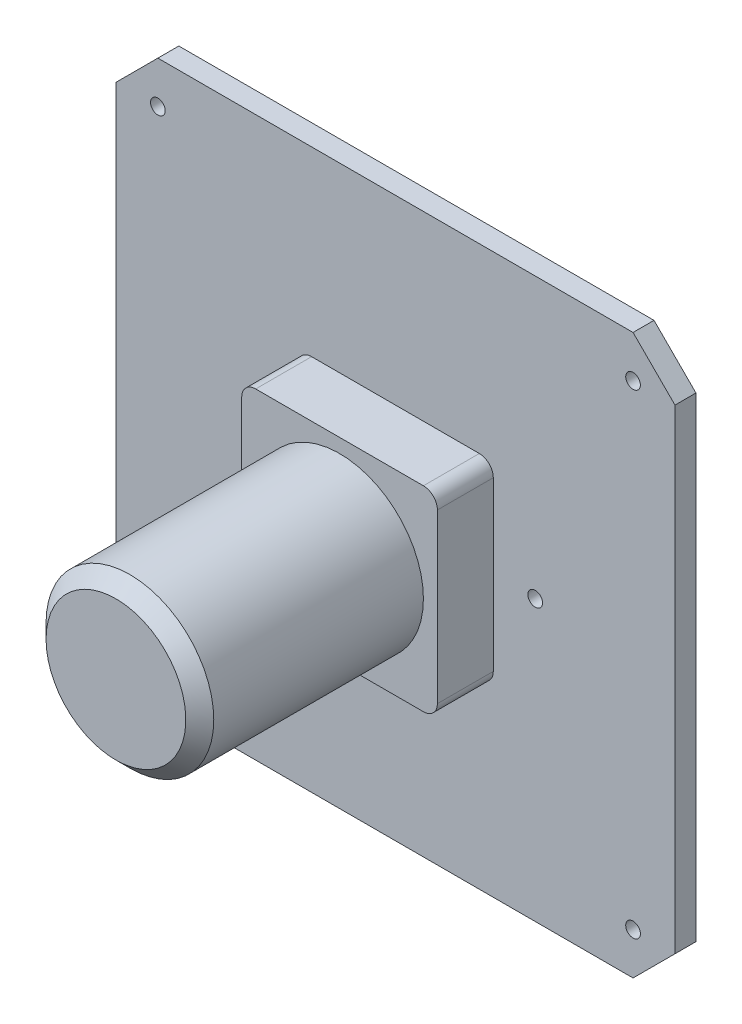
ISO-10303-21;
HEADER;
FILE_DESCRIPTION(('STEP AP214'),'2;1');
FILE_NAME('part.step','',(''),(''),'','','');
FILE_SCHEMA(('AUTOMOTIVE_DESIGN { 1 0 10303 214 1 1 1 1 }'));
ENDSEC;
DATA;
#1=APPLICATION_CONTEXT('core data for automotive mechanical design processes');
#2=APPLICATION_PROTOCOL_DEFINITION('international standard','automotive_design',2000,#1);
#3=PRODUCT_CONTEXT('',#1,'mechanical');
#4=PRODUCT('Part','Part','',(#3));
#5=PRODUCT_RELATED_PRODUCT_CATEGORY('part','',(#4));
#6=PRODUCT_DEFINITION_FORMATION('','',#4);
#7=PRODUCT_DEFINITION_CONTEXT('part definition',#1,'design');
#8=PRODUCT_DEFINITION('design','',#6,#7);
#9=PRODUCT_DEFINITION_SHAPE('','',#8);
#10=(LENGTH_UNIT() NAMED_UNIT(*) SI_UNIT(.MILLI.,.METRE.));
#11=(NAMED_UNIT(*) PLANE_ANGLE_UNIT() SI_UNIT($,.RADIAN.));
#12=(NAMED_UNIT(*) SI_UNIT($,.STERADIAN.) SOLID_ANGLE_UNIT());
#13=UNCERTAINTY_MEASURE_WITH_UNIT(LENGTH_MEASURE(1.E-05),#10,'distance_accuracy_value','');
#14=(GEOMETRIC_REPRESENTATION_CONTEXT(3) GLOBAL_UNCERTAINTY_ASSIGNED_CONTEXT((#13)) GLOBAL_UNIT_ASSIGNED_CONTEXT((#10,
#11,#12)) REPRESENTATION_CONTEXT('',''));
#15=CARTESIAN_POINT('',(0.,0.,0.));
#16=DIRECTION('',(0.,0.,1.));
#17=DIRECTION('',(1.,0.,0.));
#18=AXIS2_PLACEMENT_3D('',#15,#16,#17);
#19=CARTESIAN_POINT('',(0.,0.,1.5));
#20=DIRECTION('',(0.,0.,-1.));
#21=DIRECTION('',(-1.,0.,0.));
#22=AXIS2_PLACEMENT_3D('',#19,#20,#21);
#23=PLANE('',#22);
#24=CARTESIAN_POINT('',(10.,0.,1.5));
#25=DIRECTION('',(0.,0.,1.));
#26=DIRECTION('',(1.,0.,0.));
#27=AXIS2_PLACEMENT_3D('',#24,#25,#26);
#28=CIRCLE('',#27,0.524999999999999);
#29=CARTESIAN_POINT('',(10.525,0.,1.5));
#30=VERTEX_POINT('',#29);
#31=EDGE_CURVE('E174',#30,#30,#28,.T.);
#32=ORIENTED_EDGE('',*,*,#31,.F.);
#33=EDGE_LOOP('',(#32));
#34=FACE_BOUND('',#33,.T.);
#35=CARTESIAN_POINT('',(-10.,0.,1.5));
#36=DIRECTION('',(0.,0.,1.));
#37=DIRECTION('',(1.,0.,0.));
#38=AXIS2_PLACEMENT_3D('',#35,#36,#37);
#39=CIRCLE('',#38,0.524999999999997);
#40=CARTESIAN_POINT('',(-9.475,0.,1.5));
#41=VERTEX_POINT('',#40);
#42=EDGE_CURVE('E183',#41,#41,#39,.T.);
#43=ORIENTED_EDGE('',*,*,#42,.F.);
#44=EDGE_LOOP('',(#43));
#45=FACE_BOUND('',#44,.T.);
#46=CARTESIAN_POINT('',(-17.,-17.,1.5));
#47=DIRECTION('',(0.,0.,1.));
#48=DIRECTION('',(1.,0.,0.));
#49=AXIS2_PLACEMENT_3D('',#46,#47,#48);
#50=CIRCLE('',#49,0.525000000000001);
#51=CARTESIAN_POINT('',(-16.475,-17.,1.5));
#52=VERTEX_POINT('',#51);
#53=EDGE_CURVE('E189',#52,#52,#50,.T.);
#54=ORIENTED_EDGE('',*,*,#53,.F.);
#55=EDGE_LOOP('',(#54));
#56=FACE_BOUND('',#55,.T.);
#57=CARTESIAN_POINT('',(17.,-17.,1.5));
#58=DIRECTION('',(0.,0.,1.));
#59=DIRECTION('',(1.,0.,0.));
#60=AXIS2_PLACEMENT_3D('',#57,#58,#59);
#61=CIRCLE('',#60,0.525000000000001);
#62=CARTESIAN_POINT('',(17.525,-17.,1.5));
#63=VERTEX_POINT('',#62);
#64=EDGE_CURVE('E195',#63,#63,#61,.T.);
#65=ORIENTED_EDGE('',*,*,#64,.F.);
#66=EDGE_LOOP('',(#65));
#67=FACE_BOUND('',#66,.T.);
#68=CARTESIAN_POINT('',(17.,17.,1.5));
#69=DIRECTION('',(0.,0.,1.));
#70=DIRECTION('',(1.,0.,0.));
#71=AXIS2_PLACEMENT_3D('',#68,#69,#70);
#72=CIRCLE('',#71,0.525000000000001);
#73=CARTESIAN_POINT('',(17.525,17.,1.5));
#74=VERTEX_POINT('',#73);
#75=EDGE_CURVE('E201',#74,#74,#72,.T.);
#76=ORIENTED_EDGE('',*,*,#75,.F.);
#77=EDGE_LOOP('',(#76));
#78=FACE_BOUND('',#77,.T.);
#79=CARTESIAN_POINT('',(-17.,17.,1.5));
#80=DIRECTION('',(0.,0.,1.));
#81=DIRECTION('',(1.,0.,0.));
#82=AXIS2_PLACEMENT_3D('',#79,#80,#81);
#83=CIRCLE('',#82,0.525000000000001);
#84=CARTESIAN_POINT('',(-16.475,17.,1.5));
#85=VERTEX_POINT('',#84);
#86=EDGE_CURVE('E207',#85,#85,#83,.T.);
#87=ORIENTED_EDGE('',*,*,#86,.F.);
#88=EDGE_LOOP('',(#87));
#89=FACE_BOUND('',#88,.T.);
#90=DIRECTION('',(0.,-1.,0.));
#91=VECTOR('',#90,1.);
#92=CARTESIAN_POINT('',(-20.,-17.,1.5));
#93=LINE('',#92,#91);
#94=CARTESIAN_POINT('',(-20.,17.,1.5));
#95=VERTEX_POINT('',#94);
#96=CARTESIAN_POINT('',(-20.,-17.,1.5));
#97=VERTEX_POINT('',#96);
#98=EDGE_CURVE('E213',#95,#97,#93,.T.);
#99=ORIENTED_EDGE('',*,*,#98,.T.);
#100=DIRECTION('',(0.707106781186548,-0.707106781186548,0.));
#101=VECTOR('',#100,1.);
#102=CARTESIAN_POINT('',(-17.,-20.,1.5));
#103=LINE('',#102,#101);
#104=CARTESIAN_POINT('',(-17.,-20.,1.5));
#105=VERTEX_POINT('',#104);
#106=EDGE_CURVE('E216',#97,#105,#103,.T.);
#107=ORIENTED_EDGE('',*,*,#106,.T.);
#108=DIRECTION('',(1.,0.,0.));
#109=VECTOR('',#108,1.);
#110=CARTESIAN_POINT('',(-17.,-20.,1.5));
#111=LINE('',#110,#109);
#112=CARTESIAN_POINT('',(17.,-20.,1.5));
#113=VERTEX_POINT('',#112);
#114=EDGE_CURVE('E219',#105,#113,#111,.T.);
#115=ORIENTED_EDGE('',*,*,#114,.T.);
#116=DIRECTION('',(0.707106781186548,0.707106781186547,0.));
#117=VECTOR('',#116,1.);
#118=CARTESIAN_POINT('',(20.,-17.,1.5));
#119=LINE('',#118,#117);
#120=CARTESIAN_POINT('',(20.,-17.,1.5));
#121=VERTEX_POINT('',#120);
#122=EDGE_CURVE('E221',#113,#121,#119,.T.);
#123=ORIENTED_EDGE('',*,*,#122,.T.);
#124=DIRECTION('',(0.,1.,0.));
#125=VECTOR('',#124,1.);
#126=CARTESIAN_POINT('',(20.,-17.,1.5));
#127=LINE('',#126,#125);
#128=CARTESIAN_POINT('',(20.,17.,1.5));
#129=VERTEX_POINT('',#128);
#130=EDGE_CURVE('E223',#121,#129,#127,.T.);
#131=ORIENTED_EDGE('',*,*,#130,.T.);
#132=DIRECTION('',(-0.707106781186548,0.707106781186548,0.));
#133=VECTOR('',#132,1.);
#134=CARTESIAN_POINT('',(17.,20.,1.5));
#135=LINE('',#134,#133);
#136=CARTESIAN_POINT('',(17.,20.,1.5));
#137=VERTEX_POINT('',#136);
#138=EDGE_CURVE('E225',#129,#137,#135,.T.);
#139=ORIENTED_EDGE('',*,*,#138,.T.);
#140=DIRECTION('',(-1.,0.,0.));
#141=VECTOR('',#140,1.);
#142=CARTESIAN_POINT('',(-17.,20.,1.5));
#143=LINE('',#142,#141);
#144=CARTESIAN_POINT('',(-17.,20.,1.5));
#145=VERTEX_POINT('',#144);
#146=EDGE_CURVE('E227',#137,#145,#143,.T.);
#147=ORIENTED_EDGE('',*,*,#146,.T.);
#148=DIRECTION('',(-0.707106781186548,-0.707106781186548,0.));
#149=VECTOR('',#148,1.);
#150=CARTESIAN_POINT('',(-20.,17.,1.5));
#151=LINE('',#150,#149);
#152=EDGE_CURVE('E229',#145,#95,#151,.T.);
#153=ORIENTED_EDGE('',*,*,#152,.T.);
#154=EDGE_LOOP('',(#99,#107,#115,#123,#131,#139,#147,#153));
#155=FACE_BOUND('',#154,.T.);
#156=CARTESIAN_POINT('',(-6.,-6.,1.5));
#157=DIRECTION('',(0.,0.,1.));
#158=DIRECTION('',(1.,0.,0.));
#159=AXIS2_PLACEMENT_3D('',#156,#157,#158);
#160=CIRCLE('',#159,1.);
#161=CARTESIAN_POINT('',(-7.,-6.,1.5));
#162=VERTEX_POINT('',#161);
#163=CARTESIAN_POINT('',(-6.,-7.,1.5));
#164=VERTEX_POINT('',#163);
#165=EDGE_CURVE('E53',#162,#164,#160,.T.);
#166=ORIENTED_EDGE('',*,*,#165,.F.);
#167=DIRECTION('',(0.,-1.,0.));
#168=VECTOR('',#167,1.);
#169=CARTESIAN_POINT('',(-7.,-6.,1.5));
#170=LINE('',#169,#168);
#171=CARTESIAN_POINT('',(-7.,6.,1.5));
#172=VERTEX_POINT('',#171);
#173=EDGE_CURVE('E57',#172,#162,#170,.T.);
#174=ORIENTED_EDGE('',*,*,#173,.F.);
#175=CARTESIAN_POINT('',(-6.,6.,1.5));
#176=DIRECTION('',(0.,0.,1.));
#177=DIRECTION('',(1.,0.,0.));
#178=AXIS2_PLACEMENT_3D('',#175,#176,#177);
#179=CIRCLE('',#178,1.);
#180=CARTESIAN_POINT('',(-6.,7.,1.5));
#181=VERTEX_POINT('',#180);
#182=EDGE_CURVE('E304',#181,#172,#179,.T.);
#183=ORIENTED_EDGE('',*,*,#182,.F.);
#184=DIRECTION('',(-1.,0.,0.));
#185=VECTOR('',#184,1.);
#186=CARTESIAN_POINT('',(-6.,7.,1.5));
#187=LINE('',#186,#185);
#188=CARTESIAN_POINT('',(6.,7.,1.5));
#189=VERTEX_POINT('',#188);
#190=EDGE_CURVE('E301',#189,#181,#187,.T.);
#191=ORIENTED_EDGE('',*,*,#190,.F.);
#192=CARTESIAN_POINT('',(6.,6.,1.5));
#193=DIRECTION('',(0.,0.,1.));
#194=DIRECTION('',(1.,0.,0.));
#195=AXIS2_PLACEMENT_3D('',#192,#193,#194);
#196=CIRCLE('',#195,0.999999999999999);
#197=CARTESIAN_POINT('',(7.,6.,1.5));
#198=VERTEX_POINT('',#197);
#199=EDGE_CURVE('E298',#198,#189,#196,.T.);
#200=ORIENTED_EDGE('',*,*,#199,.F.);
#201=DIRECTION('',(0.,1.,0.));
#202=VECTOR('',#201,1.);
#203=CARTESIAN_POINT('',(7.,-6.,1.5));
#204=LINE('',#203,#202);
#205=CARTESIAN_POINT('',(7.,-6.,1.5));
#206=VERTEX_POINT('',#205);
#207=EDGE_CURVE('E295',#206,#198,#204,.T.);
#208=ORIENTED_EDGE('',*,*,#207,.F.);
#209=CARTESIAN_POINT('',(6.,-6.,1.5));
#210=DIRECTION('',(0.,0.,1.));
#211=DIRECTION('',(1.,0.,0.));
#212=AXIS2_PLACEMENT_3D('',#209,#210,#211);
#213=CIRCLE('',#212,1.);
#214=CARTESIAN_POINT('',(6.,-7.,1.5));
#215=VERTEX_POINT('',#214);
#216=EDGE_CURVE('E292',#215,#206,#213,.T.);
#217=ORIENTED_EDGE('',*,*,#216,.F.);
#218=DIRECTION('',(1.,0.,0.));
#219=VECTOR('',#218,1.);
#220=CARTESIAN_POINT('',(-6.,-7.,1.5));
#221=LINE('',#220,#219);
#222=EDGE_CURVE('E290',#164,#215,#221,.T.);
#223=ORIENTED_EDGE('',*,*,#222,.F.);
#224=EDGE_LOOP('',(#166,#174,#183,#191,#200,#208,#217,#223));
#225=FACE_BOUND('',#224,.T.);
#226=ADVANCED_FACE('F37',(#34,#45,#56,#67,#78,#89,#155,#225),#23,.F.);
#227=CARTESIAN_POINT('',(0.,0.,0.));
#228=DIRECTION('',(0.,0.,-1.));
#229=DIRECTION('',(-1.,0.,0.));
#230=AXIS2_PLACEMENT_3D('',#227,#228,#229);
#231=PLANE('',#230);
#232=CARTESIAN_POINT('',(-10.,0.,0.));
#233=DIRECTION('',(0.,0.,1.));
#234=DIRECTION('',(1.,0.,0.));
#235=AXIS2_PLACEMENT_3D('',#232,#233,#234);
#236=CIRCLE('',#235,0.524999999999997);
#237=CARTESIAN_POINT('',(-9.475,0.,0.));
#238=VERTEX_POINT('',#237);
#239=EDGE_CURVE('E181',#238,#238,#236,.T.);
#240=ORIENTED_EDGE('',*,*,#239,.T.);
#241=EDGE_LOOP('',(#240));
#242=FACE_BOUND('',#241,.T.);
#243=CARTESIAN_POINT('',(17.,-17.,0.));
#244=DIRECTION('',(0.,0.,1.));
#245=DIRECTION('',(1.,0.,0.));
#246=AXIS2_PLACEMENT_3D('',#243,#244,#245);
#247=CIRCLE('',#246,0.525000000000001);
#248=CARTESIAN_POINT('',(17.525,-17.,0.));
#249=VERTEX_POINT('',#248);
#250=EDGE_CURVE('E192',#249,#249,#247,.T.);
#251=ORIENTED_EDGE('',*,*,#250,.T.);
#252=EDGE_LOOP('',(#251));
#253=FACE_BOUND('',#252,.T.);
#254=CARTESIAN_POINT('',(-17.,17.,0.));
#255=DIRECTION('',(0.,0.,1.));
#256=DIRECTION('',(1.,0.,0.));
#257=AXIS2_PLACEMENT_3D('',#254,#255,#256);
#258=CIRCLE('',#257,0.525000000000001);
#259=CARTESIAN_POINT('',(-16.475,17.,0.));
#260=VERTEX_POINT('',#259);
#261=EDGE_CURVE('E204',#260,#260,#258,.T.);
#262=ORIENTED_EDGE('',*,*,#261,.T.);
#263=EDGE_LOOP('',(#262));
#264=FACE_BOUND('',#263,.T.);
#265=DIRECTION('',(0.,-1.,0.));
#266=VECTOR('',#265,1.);
#267=CARTESIAN_POINT('',(-20.,-17.,0.));
#268=LINE('',#267,#266);
#269=CARTESIAN_POINT('',(-20.,17.,0.));
#270=VERTEX_POINT('',#269);
#271=CARTESIAN_POINT('',(-20.,-17.,0.));
#272=VERTEX_POINT('',#271);
#273=EDGE_CURVE('E210',#270,#272,#268,.T.);
#274=ORIENTED_EDGE('',*,*,#273,.F.);
#275=DIRECTION('',(-0.707106781186548,-0.707106781186548,0.));
#276=VECTOR('',#275,1.);
#277=CARTESIAN_POINT('',(-20.,17.,0.));
#278=LINE('',#277,#276);
#279=CARTESIAN_POINT('',(-17.,20.,0.));
#280=VERTEX_POINT('',#279);
#281=EDGE_CURVE('E217',#280,#270,#278,.T.);
#282=ORIENTED_EDGE('',*,*,#281,.F.);
#283=DIRECTION('',(-1.,0.,0.));
#284=VECTOR('',#283,1.);
#285=CARTESIAN_POINT('',(-17.,20.,0.));
#286=LINE('',#285,#284);
#287=CARTESIAN_POINT('',(17.,20.,0.));
#288=VERTEX_POINT('',#287);
#289=EDGE_CURVE('E244',#288,#280,#286,.T.);
#290=ORIENTED_EDGE('',*,*,#289,.F.);
#291=DIRECTION('',(-0.707106781186548,0.707106781186548,0.));
#292=VECTOR('',#291,1.);
#293=CARTESIAN_POINT('',(17.,20.,0.));
#294=LINE('',#293,#292);
#295=CARTESIAN_POINT('',(20.,17.,0.));
#296=VERTEX_POINT('',#295);
#297=EDGE_CURVE('E242',#296,#288,#294,.T.);
#298=ORIENTED_EDGE('',*,*,#297,.F.);
#299=DIRECTION('',(0.,1.,0.));
#300=VECTOR('',#299,1.);
#301=CARTESIAN_POINT('',(20.,-17.,0.));
#302=LINE('',#301,#300);
#303=CARTESIAN_POINT('',(20.,-17.,0.));
#304=VERTEX_POINT('',#303);
#305=EDGE_CURVE('E240',#304,#296,#302,.T.);
#306=ORIENTED_EDGE('',*,*,#305,.F.);
#307=DIRECTION('',(0.707106781186548,0.707106781186547,0.));
#308=VECTOR('',#307,1.);
#309=CARTESIAN_POINT('',(20.,-17.,0.));
#310=LINE('',#309,#308);
#311=CARTESIAN_POINT('',(17.,-20.,0.));
#312=VERTEX_POINT('',#311);
#313=EDGE_CURVE('E238',#312,#304,#310,.T.);
#314=ORIENTED_EDGE('',*,*,#313,.F.);
#315=DIRECTION('',(1.,0.,0.));
#316=VECTOR('',#315,1.);
#317=CARTESIAN_POINT('',(-17.,-20.,0.));
#318=LINE('',#317,#316);
#319=CARTESIAN_POINT('',(-17.,-20.,0.));
#320=VERTEX_POINT('',#319);
#321=EDGE_CURVE('E236',#320,#312,#318,.T.);
#322=ORIENTED_EDGE('',*,*,#321,.F.);
#323=DIRECTION('',(0.707106781186548,-0.707106781186548,0.));
#324=VECTOR('',#323,1.);
#325=CARTESIAN_POINT('',(-17.,-20.,0.));
#326=LINE('',#325,#324);
#327=EDGE_CURVE('E234',#272,#320,#326,.T.);
#328=ORIENTED_EDGE('',*,*,#327,.F.);
#329=EDGE_LOOP('',(#274,#282,#290,#298,#306,#314,#322,#328));
#330=FACE_BOUND('',#329,.T.);
#331=CARTESIAN_POINT('',(17.,17.,0.));
#332=DIRECTION('',(0.,0.,1.));
#333=DIRECTION('',(1.,0.,0.));
#334=AXIS2_PLACEMENT_3D('',#331,#332,#333);
#335=CIRCLE('',#334,0.525000000000001);
#336=CARTESIAN_POINT('',(17.525,17.,0.));
#337=VERTEX_POINT('',#336);
#338=EDGE_CURVE('E198',#337,#337,#335,.T.);
#339=ORIENTED_EDGE('',*,*,#338,.T.);
#340=EDGE_LOOP('',(#339));
#341=FACE_BOUND('',#340,.T.);
#342=CARTESIAN_POINT('',(-17.,-17.,0.));
#343=DIRECTION('',(0.,0.,1.));
#344=DIRECTION('',(1.,0.,0.));
#345=AXIS2_PLACEMENT_3D('',#342,#343,#344);
#346=CIRCLE('',#345,0.525000000000001);
#347=CARTESIAN_POINT('',(-16.475,-17.,0.));
#348=VERTEX_POINT('',#347);
#349=EDGE_CURVE('E186',#348,#348,#346,.T.);
#350=ORIENTED_EDGE('',*,*,#349,.T.);
#351=EDGE_LOOP('',(#350));
#352=FACE_BOUND('',#351,.T.);
#353=CARTESIAN_POINT('',(10.,0.,0.));
#354=DIRECTION('',(0.,0.,1.));
#355=DIRECTION('',(1.,0.,0.));
#356=AXIS2_PLACEMENT_3D('',#353,#354,#355);
#357=CIRCLE('',#356,0.524999999999999);
#358=CARTESIAN_POINT('',(10.525,0.,0.));
#359=VERTEX_POINT('',#358);
#360=EDGE_CURVE('E171',#359,#359,#357,.T.);
#361=ORIENTED_EDGE('',*,*,#360,.T.);
#362=EDGE_LOOP('',(#361));
#363=FACE_BOUND('',#362,.T.);
#364=ADVANCED_FACE('F352',(#242,#253,#264,#330,#341,#352,#363),#231,.T.);
#365=CARTESIAN_POINT('',(-20.,-17.,1.5));
#366=DIRECTION('',(1.,0.,0.));
#367=DIRECTION('',(0.,0.,-1.));
#368=AXIS2_PLACEMENT_3D('',#365,#366,#367);
#369=PLANE('',#368);
#370=ORIENTED_EDGE('',*,*,#273,.T.);
#371=DIRECTION('',(0.,0.,-1.));
#372=VECTOR('',#371,1.);
#373=CARTESIAN_POINT('',(-20.,-17.,1.5));
#374=LINE('',#373,#372);
#375=EDGE_CURVE('E267',#97,#272,#374,.T.);
#376=ORIENTED_EDGE('',*,*,#375,.F.);
#377=ORIENTED_EDGE('',*,*,#98,.F.);
#378=DIRECTION('',(0.,0.,-1.));
#379=VECTOR('',#378,1.);
#380=CARTESIAN_POINT('',(-20.,17.,1.5));
#381=LINE('',#380,#379);
#382=EDGE_CURVE('E231',#95,#270,#381,.T.);
#383=ORIENTED_EDGE('',*,*,#382,.T.);
#384=EDGE_LOOP('',(#370,#376,#377,#383));
#385=FACE_BOUND('',#384,.T.);
#386=ADVANCED_FACE('F358',(#385),#369,.F.);
#387=CARTESIAN_POINT('',(-17.,-20.,1.5));
#388=DIRECTION('',(0.707106781186547,0.707106781186547,0.));
#389=DIRECTION('',(-0.707106781186548,0.707106781186548,0.));
#390=AXIS2_PLACEMENT_3D('',#387,#388,#389);
#391=PLANE('',#390);
#392=ORIENTED_EDGE('',*,*,#327,.T.);
#393=DIRECTION('',(0.,0.,-1.));
#394=VECTOR('',#393,1.);
#395=CARTESIAN_POINT('',(-17.,-20.,1.5));
#396=LINE('',#395,#394);
#397=EDGE_CURVE('E264',#105,#320,#396,.T.);
#398=ORIENTED_EDGE('',*,*,#397,.F.);
#399=ORIENTED_EDGE('',*,*,#106,.F.);
#400=ORIENTED_EDGE('',*,*,#375,.T.);
#401=EDGE_LOOP('',(#392,#398,#399,#400));
#402=FACE_BOUND('',#401,.T.);
#403=ADVANCED_FACE('F390',(#402),#391,.F.);
#404=CARTESIAN_POINT('',(-17.,-20.,1.5));
#405=DIRECTION('',(0.,1.,0.));
#406=DIRECTION('',(0.,0.,1.));
#407=AXIS2_PLACEMENT_3D('',#404,#405,#406);
#408=PLANE('',#407);
#409=ORIENTED_EDGE('',*,*,#321,.T.);
#410=DIRECTION('',(0.,0.,-1.));
#411=VECTOR('',#410,1.);
#412=CARTESIAN_POINT('',(17.,-20.,1.5));
#413=LINE('',#412,#411);
#414=EDGE_CURVE('E261',#113,#312,#413,.T.);
#415=ORIENTED_EDGE('',*,*,#414,.F.);
#416=ORIENTED_EDGE('',*,*,#114,.F.);
#417=ORIENTED_EDGE('',*,*,#397,.T.);
#418=EDGE_LOOP('',(#409,#415,#416,#417));
#419=FACE_BOUND('',#418,.T.);
#420=ADVANCED_FACE('F386',(#419),#408,.F.);
#421=CARTESIAN_POINT('',(20.,-17.,1.5));
#422=DIRECTION('',(-0.707106781186547,0.707106781186548,0.));
#423=DIRECTION('',(-0.707106781186548,-0.707106781186547,0.));
#424=AXIS2_PLACEMENT_3D('',#421,#422,#423);
#425=PLANE('',#424);
#426=ORIENTED_EDGE('',*,*,#313,.T.);
#427=DIRECTION('',(0.,0.,-1.));
#428=VECTOR('',#427,1.);
#429=CARTESIAN_POINT('',(20.,-17.,1.5));
#430=LINE('',#429,#428);
#431=EDGE_CURVE('E258',#121,#304,#430,.T.);
#432=ORIENTED_EDGE('',*,*,#431,.F.);
#433=ORIENTED_EDGE('',*,*,#122,.F.);
#434=ORIENTED_EDGE('',*,*,#414,.T.);
#435=EDGE_LOOP('',(#426,#432,#433,#434));
#436=FACE_BOUND('',#435,.T.);
#437=ADVANCED_FACE('F382',(#436),#425,.F.);
#438=CARTESIAN_POINT('',(20.,-17.,1.5));
#439=DIRECTION('',(-1.,0.,0.));
#440=DIRECTION('',(0.,0.,1.));
#441=AXIS2_PLACEMENT_3D('',#438,#439,#440);
#442=PLANE('',#441);
#443=ORIENTED_EDGE('',*,*,#305,.T.);
#444=DIRECTION('',(0.,0.,-1.));
#445=VECTOR('',#444,1.);
#446=CARTESIAN_POINT('',(20.,17.,1.5));
#447=LINE('',#446,#445);
#448=EDGE_CURVE('E255',#129,#296,#447,.T.);
#449=ORIENTED_EDGE('',*,*,#448,.F.);
#450=ORIENTED_EDGE('',*,*,#130,.F.);
#451=ORIENTED_EDGE('',*,*,#431,.T.);
#452=EDGE_LOOP('',(#443,#449,#450,#451));
#453=FACE_BOUND('',#452,.T.);
#454=ADVANCED_FACE('F378',(#453),#442,.F.);
#455=CARTESIAN_POINT('',(17.,20.,1.5));
#456=DIRECTION('',(-0.707106781186547,-0.707106781186547,0.));
#457=DIRECTION('',(0.707106781186548,-0.707106781186548,0.));
#458=AXIS2_PLACEMENT_3D('',#455,#456,#457);
#459=PLANE('',#458);
#460=ORIENTED_EDGE('',*,*,#297,.T.);
#461=DIRECTION('',(0.,0.,-1.));
#462=VECTOR('',#461,1.);
#463=CARTESIAN_POINT('',(17.,20.,1.5));
#464=LINE('',#463,#462);
#465=EDGE_CURVE('E252',#137,#288,#464,.T.);
#466=ORIENTED_EDGE('',*,*,#465,.F.);
#467=ORIENTED_EDGE('',*,*,#138,.F.);
#468=ORIENTED_EDGE('',*,*,#448,.T.);
#469=EDGE_LOOP('',(#460,#466,#467,#468));
#470=FACE_BOUND('',#469,.T.);
#471=ADVANCED_FACE('F374',(#470),#459,.F.);
#472=CARTESIAN_POINT('',(-17.,20.,1.5));
#473=DIRECTION('',(0.,-1.,0.));
#474=DIRECTION('',(0.,0.,-1.));
#475=AXIS2_PLACEMENT_3D('',#472,#473,#474);
#476=PLANE('',#475);
#477=ORIENTED_EDGE('',*,*,#289,.T.);
#478=DIRECTION('',(0.,0.,-1.));
#479=VECTOR('',#478,1.);
#480=CARTESIAN_POINT('',(-17.,20.,1.5));
#481=LINE('',#480,#479);
#482=EDGE_CURVE('E249',#145,#280,#481,.T.);
#483=ORIENTED_EDGE('',*,*,#482,.F.);
#484=ORIENTED_EDGE('',*,*,#146,.F.);
#485=ORIENTED_EDGE('',*,*,#465,.T.);
#486=EDGE_LOOP('',(#477,#483,#484,#485));
#487=FACE_BOUND('',#486,.T.);
#488=ADVANCED_FACE('F370',(#487),#476,.F.);
#489=CARTESIAN_POINT('',(-20.,17.,1.5));
#490=DIRECTION('',(0.707106781186547,-0.707106781186547,0.));
#491=DIRECTION('',(0.707106781186548,0.707106781186548,0.));
#492=AXIS2_PLACEMENT_3D('',#489,#490,#491);
#493=PLANE('',#492);
#494=ORIENTED_EDGE('',*,*,#281,.T.);
#495=ORIENTED_EDGE('',*,*,#382,.F.);
#496=ORIENTED_EDGE('',*,*,#152,.F.);
#497=ORIENTED_EDGE('',*,*,#482,.T.);
#498=EDGE_LOOP('',(#494,#495,#496,#497));
#499=FACE_BOUND('',#498,.T.);
#500=ADVANCED_FACE('F367',(#499),#493,.F.);
#501=CARTESIAN_POINT('',(-17.,17.,1.5));
#502=DIRECTION('',(0.,0.,-1.));
#503=DIRECTION('',(-1.,0.,0.));
#504=AXIS2_PLACEMENT_3D('',#501,#502,#503);
#505=CYLINDRICAL_SURFACE('',#504,0.525000000000001);
#506=ORIENTED_EDGE('',*,*,#86,.T.);
#507=EDGE_LOOP('',(#506));
#508=FACE_BOUND('',#507,.T.);
#509=ORIENTED_EDGE('',*,*,#261,.F.);
#510=EDGE_LOOP('',(#509));
#511=FACE_BOUND('',#510,.T.);
#512=ADVANCED_FACE('F364',(#508,#511),#505,.F.);
#513=CARTESIAN_POINT('',(17.,17.,1.5));
#514=DIRECTION('',(0.,0.,-1.));
#515=DIRECTION('',(-1.,0.,0.));
#516=AXIS2_PLACEMENT_3D('',#513,#514,#515);
#517=CYLINDRICAL_SURFACE('',#516,0.525000000000001);
#518=ORIENTED_EDGE('',*,*,#75,.T.);
#519=EDGE_LOOP('',(#518));
#520=FACE_BOUND('',#519,.T.);
#521=ORIENTED_EDGE('',*,*,#338,.F.);
#522=EDGE_LOOP('',(#521));
#523=FACE_BOUND('',#522,.T.);
#524=ADVANCED_FACE('F449',(#520,#523),#517,.F.);
#525=CARTESIAN_POINT('',(17.,-17.,1.5));
#526=DIRECTION('',(0.,0.,-1.));
#527=DIRECTION('',(-1.,0.,0.));
#528=AXIS2_PLACEMENT_3D('',#525,#526,#527);
#529=CYLINDRICAL_SURFACE('',#528,0.525000000000001);
#530=ORIENTED_EDGE('',*,*,#64,.T.);
#531=EDGE_LOOP('',(#530));
#532=FACE_BOUND('',#531,.T.);
#533=ORIENTED_EDGE('',*,*,#250,.F.);
#534=EDGE_LOOP('',(#533));
#535=FACE_BOUND('',#534,.T.);
#536=ADVANCED_FACE('F446',(#532,#535),#529,.F.);
#537=CARTESIAN_POINT('',(-17.,-17.,1.5));
#538=DIRECTION('',(0.,0.,-1.));
#539=DIRECTION('',(-1.,0.,0.));
#540=AXIS2_PLACEMENT_3D('',#537,#538,#539);
#541=CYLINDRICAL_SURFACE('',#540,0.525000000000001);
#542=ORIENTED_EDGE('',*,*,#53,.T.);
#543=EDGE_LOOP('',(#542));
#544=FACE_BOUND('',#543,.T.);
#545=ORIENTED_EDGE('',*,*,#349,.F.);
#546=EDGE_LOOP('',(#545));
#547=FACE_BOUND('',#546,.T.);
#548=ADVANCED_FACE('F439',(#544,#547),#541,.F.);
#549=CARTESIAN_POINT('',(-10.,0.,1.5));
#550=DIRECTION('',(0.,0.,-1.));
#551=DIRECTION('',(-1.,0.,0.));
#552=AXIS2_PLACEMENT_3D('',#549,#550,#551);
#553=CYLINDRICAL_SURFACE('',#552,0.524999999999997);
#554=ORIENTED_EDGE('',*,*,#42,.T.);
#555=EDGE_LOOP('',(#554));
#556=FACE_BOUND('',#555,.T.);
#557=ORIENTED_EDGE('',*,*,#239,.F.);
#558=EDGE_LOOP('',(#557));
#559=FACE_BOUND('',#558,.T.);
#560=ADVANCED_FACE('F431',(#556,#559),#553,.F.);
#561=CARTESIAN_POINT('',(10.,0.,1.5));
#562=DIRECTION('',(0.,0.,-1.));
#563=DIRECTION('',(-1.,0.,0.));
#564=AXIS2_PLACEMENT_3D('',#561,#562,#563);
#565=CYLINDRICAL_SURFACE('',#564,0.524999999999999);
#566=ORIENTED_EDGE('',*,*,#31,.T.);
#567=EDGE_LOOP('',(#566));
#568=FACE_BOUND('',#567,.T.);
#569=ORIENTED_EDGE('',*,*,#360,.F.);
#570=EDGE_LOOP('',(#569));
#571=FACE_BOUND('',#570,.T.);
#572=ADVANCED_FACE('F429',(#568,#571),#565,.F.);
#573=CARTESIAN_POINT('',(-6.,-6.,5.5));
#574=DIRECTION('',(0.,0.,-1.));
#575=DIRECTION('',(-1.,0.,0.));
#576=AXIS2_PLACEMENT_3D('',#573,#574,#575);
#577=CYLINDRICAL_SURFACE('',#576,1.);
#578=ORIENTED_EDGE('',*,*,#165,.T.);
#579=DIRECTION('',(0.,0.,-1.));
#580=VECTOR('',#579,1.);
#581=CARTESIAN_POINT('',(-6.,-7.,5.5));
#582=LINE('',#581,#580);
#583=CARTESIAN_POINT('',(-6.,-7.,5.5));
#584=VERTEX_POINT('',#583);
#585=EDGE_CURVE('E154',#584,#164,#582,.T.);
#586=ORIENTED_EDGE('',*,*,#585,.F.);
#587=CARTESIAN_POINT('',(-6.,-6.,5.5));
#588=DIRECTION('',(0.,0.,1.));
#589=DIRECTION('',(1.,0.,0.));
#590=AXIS2_PLACEMENT_3D('',#587,#588,#589);
#591=CIRCLE('',#590,1.);
#592=CARTESIAN_POINT('',(-7.,-6.,5.5));
#593=VERTEX_POINT('',#592);
#594=EDGE_CURVE('E160',#593,#584,#591,.T.);
#595=ORIENTED_EDGE('',*,*,#594,.F.);
#596=DIRECTION('',(0.,0.,-1.));
#597=VECTOR('',#596,1.);
#598=CARTESIAN_POINT('',(-7.,-6.,5.5));
#599=LINE('',#598,#597);
#600=EDGE_CURVE('E288',#593,#162,#599,.T.);
#601=ORIENTED_EDGE('',*,*,#600,.T.);
#602=EDGE_LOOP('',(#578,#586,#595,#601));
#603=FACE_BOUND('',#602,.T.);
#604=ADVANCED_FACE('F170',(#603),#577,.T.);
#605=CARTESIAN_POINT('',(-6.,-7.,5.5));
#606=DIRECTION('',(0.,1.,0.));
#607=DIRECTION('',(-1.,0.,0.));
#608=AXIS2_PLACEMENT_3D('',#605,#606,#607);
#609=PLANE('',#608);
#610=ORIENTED_EDGE('',*,*,#222,.T.);
#611=DIRECTION('',(0.,0.,-1.));
#612=VECTOR('',#611,1.);
#613=CARTESIAN_POINT('',(6.,-7.,5.5));
#614=LINE('',#613,#612);
#615=CARTESIAN_POINT('',(6.,-7.,5.5));
#616=VERTEX_POINT('',#615);
#617=EDGE_CURVE('E156',#616,#215,#614,.T.);
#618=ORIENTED_EDGE('',*,*,#617,.F.);
#619=DIRECTION('',(1.,0.,0.));
#620=VECTOR('',#619,1.);
#621=CARTESIAN_POINT('',(-6.,-7.,5.5));
#622=LINE('',#621,#620);
#623=EDGE_CURVE('E149',#584,#616,#622,.T.);
#624=ORIENTED_EDGE('',*,*,#623,.F.);
#625=ORIENTED_EDGE('',*,*,#585,.T.);
#626=EDGE_LOOP('',(#610,#618,#624,#625));
#627=FACE_BOUND('',#626,.T.);
#628=ADVANCED_FACE('F152',(#627),#609,.F.);
#629=CARTESIAN_POINT('',(6.,-6.,5.5));
#630=DIRECTION('',(0.,0.,-1.));
#631=DIRECTION('',(-1.,0.,0.));
#632=AXIS2_PLACEMENT_3D('',#629,#630,#631);
#633=CYLINDRICAL_SURFACE('',#632,1.);
#634=ORIENTED_EDGE('',*,*,#216,.T.);
#635=DIRECTION('',(0.,0.,-1.));
#636=VECTOR('',#635,1.);
#637=CARTESIAN_POINT('',(7.,-6.,5.5));
#638=LINE('',#637,#636);
#639=CARTESIAN_POINT('',(7.,-6.,5.5));
#640=VERTEX_POINT('',#639);
#641=EDGE_CURVE('E176',#640,#206,#638,.T.);
#642=ORIENTED_EDGE('',*,*,#641,.F.);
#643=CARTESIAN_POINT('',(6.,-6.,5.5));
#644=DIRECTION('',(0.,0.,1.));
#645=DIRECTION('',(1.,0.,0.));
#646=AXIS2_PLACEMENT_3D('',#643,#644,#645);
#647=CIRCLE('',#646,1.);
#648=EDGE_CURVE('E159',#616,#640,#647,.T.);
#649=ORIENTED_EDGE('',*,*,#648,.F.);
#650=ORIENTED_EDGE('',*,*,#617,.T.);
#651=EDGE_LOOP('',(#634,#642,#649,#650));
#652=FACE_BOUND('',#651,.T.);
#653=ADVANCED_FACE('F326',(#652),#633,.T.);
#654=CARTESIAN_POINT('',(7.,-6.,5.5));
#655=DIRECTION('',(-1.,0.,0.));
#656=DIRECTION('',(0.,-1.,0.));
#657=AXIS2_PLACEMENT_3D('',#654,#655,#656);
#658=PLANE('',#657);
#659=ORIENTED_EDGE('',*,*,#207,.T.);
#660=DIRECTION('',(0.,0.,-1.));
#661=VECTOR('',#660,1.);
#662=CARTESIAN_POINT('',(7.,6.,5.5));
#663=LINE('',#662,#661);
#664=CARTESIAN_POINT('',(7.,6.,5.5));
#665=VERTEX_POINT('',#664);
#666=EDGE_CURVE('E317',#665,#198,#663,.T.);
#667=ORIENTED_EDGE('',*,*,#666,.F.);
#668=DIRECTION('',(0.,1.,0.));
#669=VECTOR('',#668,1.);
#670=CARTESIAN_POINT('',(7.,-6.,5.5));
#671=LINE('',#670,#669);
#672=EDGE_CURVE('E279',#640,#665,#671,.T.);
#673=ORIENTED_EDGE('',*,*,#672,.F.);
#674=ORIENTED_EDGE('',*,*,#641,.T.);
#675=EDGE_LOOP('',(#659,#667,#673,#674));
#676=FACE_BOUND('',#675,.T.);
#677=ADVANCED_FACE('F323',(#676),#658,.F.);
#678=CARTESIAN_POINT('',(6.,6.,5.5));
#679=DIRECTION('',(0.,0.,-1.));
#680=DIRECTION('',(-1.,0.,0.));
#681=AXIS2_PLACEMENT_3D('',#678,#679,#680);
#682=CYLINDRICAL_SURFACE('',#681,0.999999999999999);
#683=ORIENTED_EDGE('',*,*,#199,.T.);
#684=DIRECTION('',(0.,0.,-1.));
#685=VECTOR('',#684,1.);
#686=CARTESIAN_POINT('',(6.,7.,5.5));
#687=LINE('',#686,#685);
#688=CARTESIAN_POINT('',(6.,7.,5.5));
#689=VERTEX_POINT('',#688);
#690=EDGE_CURVE('E314',#689,#189,#687,.T.);
#691=ORIENTED_EDGE('',*,*,#690,.F.);
#692=CARTESIAN_POINT('',(6.,6.,5.5));
#693=DIRECTION('',(0.,0.,1.));
#694=DIRECTION('',(1.,0.,0.));
#695=AXIS2_PLACEMENT_3D('',#692,#693,#694);
#696=CIRCLE('',#695,0.999999999999999);
#697=EDGE_CURVE('E281',#665,#689,#696,.T.);
#698=ORIENTED_EDGE('',*,*,#697,.F.);
#699=ORIENTED_EDGE('',*,*,#666,.T.);
#700=EDGE_LOOP('',(#683,#691,#698,#699));
#701=FACE_BOUND('',#700,.T.);
#702=ADVANCED_FACE('F329',(#701),#682,.T.);
#703=CARTESIAN_POINT('',(-6.,7.,5.5));
#704=DIRECTION('',(0.,-1.,0.));
#705=DIRECTION('',(0.,0.,-1.));
#706=AXIS2_PLACEMENT_3D('',#703,#704,#705);
#707=PLANE('',#706);
#708=ORIENTED_EDGE('',*,*,#190,.T.);
#709=DIRECTION('',(0.,0.,-1.));
#710=VECTOR('',#709,1.);
#711=CARTESIAN_POINT('',(-6.,7.,5.5));
#712=LINE('',#711,#710);
#713=CARTESIAN_POINT('',(-6.,7.,5.5));
#714=VERTEX_POINT('',#713);
#715=EDGE_CURVE('E311',#714,#181,#712,.T.);
#716=ORIENTED_EDGE('',*,*,#715,.F.);
#717=DIRECTION('',(-1.,0.,0.));
#718=VECTOR('',#717,1.);
#719=CARTESIAN_POINT('',(-6.,7.,5.5));
#720=LINE('',#719,#718);
#721=EDGE_CURVE('E283',#689,#714,#720,.T.);
#722=ORIENTED_EDGE('',*,*,#721,.F.);
#723=ORIENTED_EDGE('',*,*,#690,.T.);
#724=EDGE_LOOP('',(#708,#716,#722,#723));
#725=FACE_BOUND('',#724,.T.);
#726=ADVANCED_FACE('F333',(#725),#707,.F.);
#727=CARTESIAN_POINT('',(-6.,6.,5.5));
#728=DIRECTION('',(0.,0.,-1.));
#729=DIRECTION('',(-1.,0.,0.));
#730=AXIS2_PLACEMENT_3D('',#727,#728,#729);
#731=CYLINDRICAL_SURFACE('',#730,1.);
#732=ORIENTED_EDGE('',*,*,#182,.T.);
#733=DIRECTION('',(0.,0.,-1.));
#734=VECTOR('',#733,1.);
#735=CARTESIAN_POINT('',(-7.,6.,5.5));
#736=LINE('',#735,#734);
#737=CARTESIAN_POINT('',(-7.,6.,5.5));
#738=VERTEX_POINT('',#737);
#739=EDGE_CURVE('E308',#738,#172,#736,.T.);
#740=ORIENTED_EDGE('',*,*,#739,.F.);
#741=CARTESIAN_POINT('',(-6.,6.,5.5));
#742=DIRECTION('',(0.,0.,1.));
#743=DIRECTION('',(1.,0.,0.));
#744=AXIS2_PLACEMENT_3D('',#741,#742,#743);
#745=CIRCLE('',#744,1.);
#746=EDGE_CURVE('E285',#714,#738,#745,.T.);
#747=ORIENTED_EDGE('',*,*,#746,.F.);
#748=ORIENTED_EDGE('',*,*,#715,.T.);
#749=EDGE_LOOP('',(#732,#740,#747,#748));
#750=FACE_BOUND('',#749,.T.);
#751=ADVANCED_FACE('F338',(#750),#731,.T.);
#752=CARTESIAN_POINT('',(-7.,-6.,5.5));
#753=DIRECTION('',(1.,0.,0.));
#754=DIRECTION('',(0.,0.,-1.));
#755=AXIS2_PLACEMENT_3D('',#752,#753,#754);
#756=PLANE('',#755);
#757=ORIENTED_EDGE('',*,*,#173,.T.);
#758=ORIENTED_EDGE('',*,*,#600,.F.);
#759=DIRECTION('',(0.,-1.,0.));
#760=VECTOR('',#759,1.);
#761=CARTESIAN_POINT('',(-7.,-6.,5.5));
#762=LINE('',#761,#760);
#763=EDGE_CURVE('E165',#738,#593,#762,.T.);
#764=ORIENTED_EDGE('',*,*,#763,.F.);
#765=ORIENTED_EDGE('',*,*,#739,.T.);
#766=EDGE_LOOP('',(#757,#758,#764,#765));
#767=FACE_BOUND('',#766,.T.);
#768=ADVANCED_FACE('F340',(#767),#756,.F.);
#769=CARTESIAN_POINT('',(-6.,-6.,5.5));
#770=DIRECTION('',(0.,0.,1.));
#771=DIRECTION('',(1.,0.,0.));
#772=AXIS2_PLACEMENT_3D('',#769,#770,#771);
#773=PLANE('',#772);
#774=CARTESIAN_POINT('',(0.,0.,5.49999999999995));
#775=DIRECTION('',(0.,0.,1.));
#776=DIRECTION('',(1.,0.,0.));
#777=AXIS2_PLACEMENT_3D('',#774,#775,#776);
#778=CIRCLE('',#777,6.00000000000002);
#779=CARTESIAN_POINT('',(6.00000000000004,0.,5.49999999999993));
#780=VERTEX_POINT('',#779);
#781=EDGE_CURVE('E269',#780,#780,#778,.T.);
#782=ORIENTED_EDGE('',*,*,#781,.F.);
#783=EDGE_LOOP('',(#782));
#784=FACE_BOUND('',#783,.T.);
#785=ORIENTED_EDGE('',*,*,#594,.T.);
#786=ORIENTED_EDGE('',*,*,#623,.T.);
#787=ORIENTED_EDGE('',*,*,#648,.T.);
#788=ORIENTED_EDGE('',*,*,#672,.T.);
#789=ORIENTED_EDGE('',*,*,#697,.T.);
#790=ORIENTED_EDGE('',*,*,#721,.T.);
#791=ORIENTED_EDGE('',*,*,#746,.T.);
#792=ORIENTED_EDGE('',*,*,#763,.T.);
#793=EDGE_LOOP('',(#785,#786,#787,#788,#789,#790,#791,#792));
#794=FACE_BOUND('',#793,.T.);
#795=ADVANCED_FACE('F163',(#784,#794),#773,.T.);
#796=CARTESIAN_POINT('',(3.43024899888577E-12,0.,1000.));
#797=DIRECTION('',(0.,0.,1.));
#798=DIRECTION('',(1.,0.,0.));
#799=AXIS2_PLACEMENT_3D('',#796,#797,#798);
#800=CYLINDRICAL_SURFACE('',#799,6.00000000000005);
#801=CARTESIAN_POINT('',(0.,0.,20.5));
#802=DIRECTION('',(0.,0.,-1.));
#803=DIRECTION('',(-1.,0.,0.));
#804=AXIS2_PLACEMENT_3D('',#801,#802,#803);
#805=CIRCLE('',#804,6.00000000000005);
#806=CARTESIAN_POINT('',(-5.99999999999998,0.,20.5));
#807=VERTEX_POINT('',#806);
#808=EDGE_CURVE('E11',#807,#807,#805,.T.);
#809=ORIENTED_EDGE('',*,*,#808,.T.);
#810=EDGE_LOOP('',(#809));
#811=FACE_BOUND('',#810,.T.);
#812=ORIENTED_EDGE('',*,*,#781,.T.);
#813=EDGE_LOOP('',(#812));
#814=FACE_BOUND('',#813,.T.);
#815=ADVANCED_FACE('F347',(#811,#814),#800,.T.);
#816=CARTESIAN_POINT('',(-6.,0.,21.5));
#817=DIRECTION('',(0.,0.,-1.));
#818=DIRECTION('',(-1.,0.,0.));
#819=AXIS2_PLACEMENT_3D('',#816,#817,#818);
#820=PLANE('',#819);
#821=CARTESIAN_POINT('',(0.,0.,21.5));
#822=DIRECTION('',(0.,0.,-1.));
#823=DIRECTION('',(-1.,0.,0.));
#824=AXIS2_PLACEMENT_3D('',#821,#822,#823);
#825=CIRCLE('',#824,5.);
#826=CARTESIAN_POINT('',(-4.99999999999993,0.,21.5));
#827=VERTEX_POINT('',#826);
#828=EDGE_CURVE('E46',#827,#827,#825,.F.);
#829=ORIENTED_EDGE('',*,*,#828,.T.);
#830=EDGE_LOOP('',(#829));
#831=FACE_BOUND('',#830,.T.);
#832=ADVANCED_FACE('F581',(#831),#820,.F.);
#833=CARTESIAN_POINT('',(0.,0.,21.5));
#834=DIRECTION('',(0.,0.,-1.));
#835=DIRECTION('',(-1.,0.,0.));
#836=AXIS2_PLACEMENT_3D('',#833,#834,#835);
#837=CONICAL_SURFACE('',#836,5.00000000000003,0.785398163397456);
#838=ORIENTED_EDGE('',*,*,#808,.F.);
#839=EDGE_LOOP('',(#838));
#840=FACE_BOUND('',#839,.T.);
#841=ORIENTED_EDGE('',*,*,#828,.F.);
#842=EDGE_LOOP('',(#841));
#843=FACE_BOUND('',#842,.T.);
#844=ADVANCED_FACE('F40',(#840,#843),#837,.T.);
#845=CLOSED_SHELL('',(#226,#364,#386,#403,#420,#437,#454,#471,#488,#500,#512,#524,#536,#548,
#560,#572,#604,#628,#653,#677,#702,#726,#751,#768,#795,#815,#832,#844));
#846=MANIFOLD_SOLID_BREP('B2',#845);
#847=ADVANCED_BREP_SHAPE_REPRESENTATION('',(#18,#846),#14);
#848=SHAPE_DEFINITION_REPRESENTATION(#9,#847);
ENDSEC;
END-ISO-10303-21;
